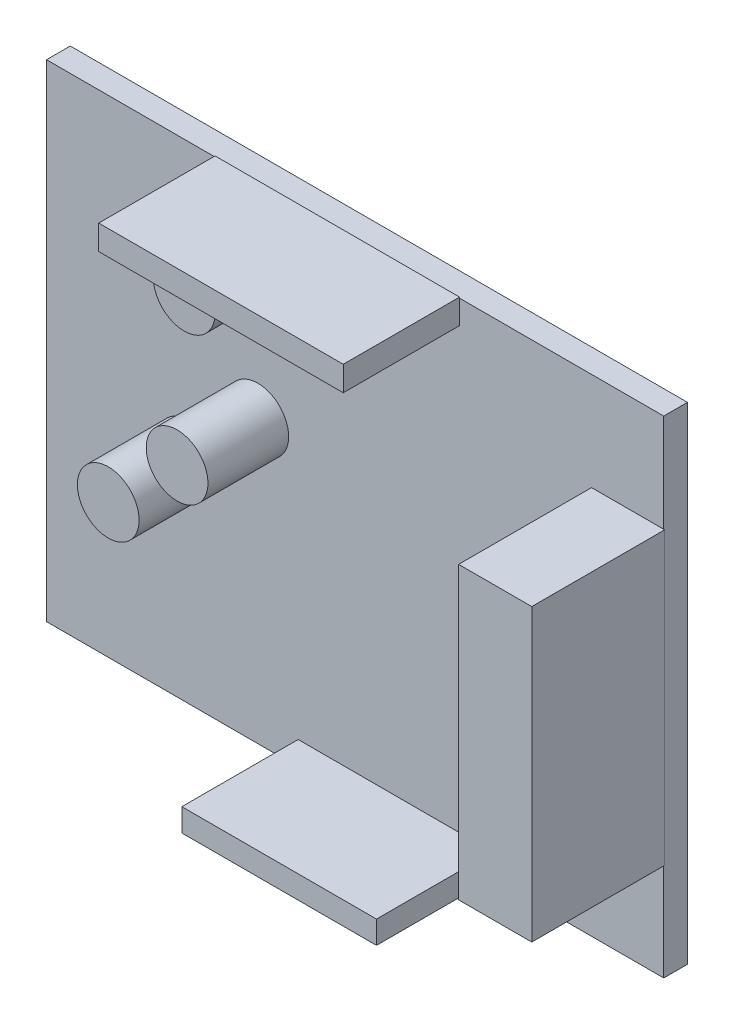
ISO-10303-21;
HEADER;
FILE_DESCRIPTION(('STEP AP214'),'2;1');
FILE_NAME('part.step','',(''),(''),'','','');
FILE_SCHEMA(('AUTOMOTIVE_DESIGN { 1 0 10303 214 1 1 1 1 }'));
ENDSEC;
DATA;
#1=APPLICATION_CONTEXT('core data for automotive mechanical design processes');
#2=APPLICATION_PROTOCOL_DEFINITION('international standard','automotive_design',2000,#1);
#3=PRODUCT_CONTEXT('',#1,'mechanical');
#4=PRODUCT('Part','Part','',(#3));
#5=PRODUCT_RELATED_PRODUCT_CATEGORY('part','',(#4));
#6=PRODUCT_DEFINITION_FORMATION('','',#4);
#7=PRODUCT_DEFINITION_CONTEXT('part definition',#1,'design');
#8=PRODUCT_DEFINITION('design','',#6,#7);
#9=PRODUCT_DEFINITION_SHAPE('','',#8);
#10=(LENGTH_UNIT() NAMED_UNIT(*) SI_UNIT(.MILLI.,.METRE.));
#11=(NAMED_UNIT(*) PLANE_ANGLE_UNIT() SI_UNIT($,.RADIAN.));
#12=(NAMED_UNIT(*) SI_UNIT($,.STERADIAN.) SOLID_ANGLE_UNIT());
#13=UNCERTAINTY_MEASURE_WITH_UNIT(LENGTH_MEASURE(1.E-05),#10,'distance_accuracy_value','');
#14=(GEOMETRIC_REPRESENTATION_CONTEXT(3) GLOBAL_UNCERTAINTY_ASSIGNED_CONTEXT((#13)) GLOBAL_UNIT_ASSIGNED_CONTEXT((#10,
#11,#12)) REPRESENTATION_CONTEXT('',''));
#15=CARTESIAN_POINT('',(0.,0.,0.));
#16=DIRECTION('',(0.,0.,1.));
#17=DIRECTION('',(1.,0.,0.));
#18=AXIS2_PLACEMENT_3D('',#15,#16,#17);
#19=CARTESIAN_POINT('',(-6.,-23.125,12.25));
#20=DIRECTION('',(1.,0.,0.));
#21=DIRECTION('',(0.,0.,-1.));
#22=AXIS2_PLACEMENT_3D('',#19,#20,#21);
#23=PLANE('',#22);
#24=DIRECTION('',(0.,0.,-1.));
#25=VECTOR('',#24,1.);
#26=CARTESIAN_POINT('',(-6.,-25.525,12.25));
#27=LINE('',#26,#25);
#28=CARTESIAN_POINT('',(-6.,-25.525,12.25));
#29=VERTEX_POINT('',#28);
#30=CARTESIAN_POINT('',(-6.,-25.525,0.));
#31=VERTEX_POINT('',#30);
#32=EDGE_CURVE('E216',#29,#31,#27,.T.);
#33=ORIENTED_EDGE('',*,*,#32,.F.);
#34=DIRECTION('',(0.,-1.,0.));
#35=VECTOR('',#34,1.);
#36=CARTESIAN_POINT('',(-6.,-23.125,12.25));
#37=LINE('',#36,#35);
#38=CARTESIAN_POINT('',(-6.,-23.125,12.25));
#39=VERTEX_POINT('',#38);
#40=EDGE_CURVE('E225',#39,#29,#37,.T.);
#41=ORIENTED_EDGE('',*,*,#40,.F.);
#42=DIRECTION('',(0.,0.,-1.));
#43=VECTOR('',#42,1.);
#44=CARTESIAN_POINT('',(-6.,-23.125,12.25));
#45=LINE('',#44,#43);
#46=CARTESIAN_POINT('',(-6.,-23.125,0.));
#47=VERTEX_POINT('',#46);
#48=EDGE_CURVE('E233',#39,#47,#45,.T.);
#49=ORIENTED_EDGE('',*,*,#48,.T.);
#50=DIRECTION('',(0.,-1.,0.));
#51=VECTOR('',#50,1.);
#52=CARTESIAN_POINT('',(-6.,-23.125,0.));
#53=LINE('',#52,#51);
#54=EDGE_CURVE('E224',#47,#31,#53,.T.);
#55=ORIENTED_EDGE('',*,*,#54,.T.);
#56=EDGE_LOOP('',(#33,#41,#49,#55));
#57=FACE_BOUND('',#56,.T.);
#58=ADVANCED_FACE('F33',(#57),#23,.F.);
#59=CARTESIAN_POINT('',(14.5,-23.125,12.25));
#60=DIRECTION('',(-1.,0.,0.));
#61=DIRECTION('',(0.,-1.,0.));
#62=AXIS2_PLACEMENT_3D('',#59,#60,#61);
#63=PLANE('',#62);
#64=DIRECTION('',(0.,0.,1.));
#65=VECTOR('',#64,1.);
#66=CARTESIAN_POINT('',(14.5,-25.525,12.25));
#67=LINE('',#66,#65);
#68=CARTESIAN_POINT('',(14.5,-25.525,0.));
#69=VERTEX_POINT('',#68);
#70=CARTESIAN_POINT('',(14.5,-25.525,12.25));
#71=VERTEX_POINT('',#70);
#72=EDGE_CURVE('E48',#69,#71,#67,.T.);
#73=ORIENTED_EDGE('',*,*,#72,.F.);
#74=DIRECTION('',(0.,1.,0.));
#75=VECTOR('',#74,1.);
#76=CARTESIAN_POINT('',(14.5,-23.125,0.));
#77=LINE('',#76,#75);
#78=CARTESIAN_POINT('',(14.5,-23.125,0.));
#79=VERTEX_POINT('',#78);
#80=EDGE_CURVE('E55',#69,#79,#77,.T.);
#81=ORIENTED_EDGE('',*,*,#80,.T.);
#82=DIRECTION('',(0.,0.,-1.));
#83=VECTOR('',#82,1.);
#84=CARTESIAN_POINT('',(14.5,-23.125,12.25));
#85=LINE('',#84,#83);
#86=CARTESIAN_POINT('',(14.5,-23.125,12.25));
#87=VERTEX_POINT('',#86);
#88=EDGE_CURVE('E241',#87,#79,#85,.T.);
#89=ORIENTED_EDGE('',*,*,#88,.F.);
#90=DIRECTION('',(0.,1.,0.));
#91=VECTOR('',#90,1.);
#92=CARTESIAN_POINT('',(14.5,-23.125,12.25));
#93=LINE('',#92,#91);
#94=EDGE_CURVE('E228',#71,#87,#93,.T.);
#95=ORIENTED_EDGE('',*,*,#94,.F.);
#96=EDGE_LOOP('',(#73,#81,#89,#95));
#97=FACE_BOUND('',#96,.T.);
#98=ADVANCED_FACE('F347',(#97),#63,.F.);
#99=CARTESIAN_POINT('',(0.,0.,12.25));
#100=DIRECTION('',(0.,0.,1.));
#101=DIRECTION('',(1.,0.,0.));
#102=AXIS2_PLACEMENT_3D('',#99,#100,#101);
#103=PLANE('',#102);
#104=ORIENTED_EDGE('',*,*,#40,.T.);
#105=DIRECTION('',(-1.,0.,0.));
#106=VECTOR('',#105,1.);
#107=CARTESIAN_POINT('',(-6.,-25.525,12.25));
#108=LINE('',#107,#106);
#109=EDGE_CURVE('E222',#71,#29,#108,.T.);
#110=ORIENTED_EDGE('',*,*,#109,.F.);
#111=ORIENTED_EDGE('',*,*,#94,.T.);
#112=DIRECTION('',(-1.,0.,0.));
#113=VECTOR('',#112,1.);
#114=CARTESIAN_POINT('',(-6.,-23.125,12.25));
#115=LINE('',#114,#113);
#116=EDGE_CURVE('E231',#87,#39,#115,.T.);
#117=ORIENTED_EDGE('',*,*,#116,.T.);
#118=EDGE_LOOP('',(#104,#110,#111,#117));
#119=FACE_BOUND('',#118,.T.);
#120=ADVANCED_FACE('F335',(#119),#103,.T.);
#121=CARTESIAN_POINT('',(0.,0.,0.));
#122=DIRECTION('',(0.,0.,1.));
#123=DIRECTION('',(1.,0.,0.));
#124=AXIS2_PLACEMENT_3D('',#121,#122,#123);
#125=PLANE('',#124);
#126=DIRECTION('',(1.,0.,0.));
#127=VECTOR('',#126,1.);
#128=CARTESIAN_POINT('',(32.5,-25.625,0.));
#129=LINE('',#128,#127);
#130=CARTESIAN_POINT('',(-32.5,-25.625,0.));
#131=VERTEX_POINT('',#130);
#132=CARTESIAN_POINT('',(32.5,-25.625,0.));
#133=VERTEX_POINT('',#132);
#134=EDGE_CURVE('E310',#131,#133,#129,.T.);
#135=ORIENTED_EDGE('',*,*,#134,.T.);
#136=DIRECTION('',(0.,1.,0.));
#137=VECTOR('',#136,1.);
#138=CARTESIAN_POINT('',(32.5,-25.625,0.));
#139=LINE('',#138,#137);
#140=CARTESIAN_POINT('',(32.5,-15.3,0.));
#141=VERTEX_POINT('',#140);
#142=EDGE_CURVE('E313',#133,#141,#139,.T.);
#143=ORIENTED_EDGE('',*,*,#142,.T.);
#144=DIRECTION('',(1.,0.,0.));
#145=VECTOR('',#144,1.);
#146=CARTESIAN_POINT('',(32.5,-15.3,0.));
#147=LINE('',#146,#145);
#148=CARTESIAN_POINT('',(24.9,-15.3,0.));
#149=VERTEX_POINT('',#148);
#150=EDGE_CURVE('E285',#149,#141,#147,.T.);
#151=ORIENTED_EDGE('',*,*,#150,.F.);
#152=DIRECTION('',(0.,-1.,0.));
#153=VECTOR('',#152,1.);
#154=CARTESIAN_POINT('',(24.9,-15.3,0.));
#155=LINE('',#154,#153);
#156=CARTESIAN_POINT('',(24.9,15.3,0.));
#157=VERTEX_POINT('',#156);
#158=EDGE_CURVE('E276',#157,#149,#155,.T.);
#159=ORIENTED_EDGE('',*,*,#158,.F.);
#160=DIRECTION('',(-1.,0.,0.));
#161=VECTOR('',#160,1.);
#162=CARTESIAN_POINT('',(32.5,15.3,0.));
#163=LINE('',#162,#161);
#164=CARTESIAN_POINT('',(32.5,15.3,0.));
#165=VERTEX_POINT('',#164);
#166=EDGE_CURVE('E279',#165,#157,#163,.T.);
#167=ORIENTED_EDGE('',*,*,#166,.F.);
#168=CARTESIAN_POINT('',(32.5,25.625,0.));
#169=VERTEX_POINT('',#168);
#170=EDGE_CURVE('E312',#165,#169,#139,.T.);
#171=ORIENTED_EDGE('',*,*,#170,.T.);
#172=DIRECTION('',(-1.,0.,0.));
#173=VECTOR('',#172,1.);
#174=CARTESIAN_POINT('',(32.5,25.625,0.));
#175=LINE('',#174,#173);
#176=CARTESIAN_POINT('',(11.,25.625,0.));
#177=VERTEX_POINT('',#176);
#178=EDGE_CURVE('E298',#169,#177,#175,.T.);
#179=ORIENTED_EDGE('',*,*,#178,.T.);
#180=DIRECTION('',(0.,1.,0.));
#181=VECTOR('',#180,1.);
#182=CARTESIAN_POINT('',(11.,25.625,0.));
#183=LINE('',#182,#181);
#184=CARTESIAN_POINT('',(11.,23.125,0.));
#185=VERTEX_POINT('',#184);
#186=EDGE_CURVE('E255',#185,#177,#183,.T.);
#187=ORIENTED_EDGE('',*,*,#186,.F.);
#188=DIRECTION('',(1.,0.,0.));
#189=VECTOR('',#188,1.);
#190=CARTESIAN_POINT('',(-14.75,23.125,0.));
#191=LINE('',#190,#189);
#192=CARTESIAN_POINT('',(-14.75,23.125,0.));
#193=VERTEX_POINT('',#192);
#194=EDGE_CURVE('E262',#193,#185,#191,.T.);
#195=ORIENTED_EDGE('',*,*,#194,.F.);
#196=DIRECTION('',(0.,-1.,0.));
#197=VECTOR('',#196,1.);
#198=CARTESIAN_POINT('',(-14.75,25.625,0.));
#199=LINE('',#198,#197);
#200=CARTESIAN_POINT('',(-14.75,25.625,0.));
#201=VERTEX_POINT('',#200);
#202=EDGE_CURVE('E248',#201,#193,#199,.T.);
#203=ORIENTED_EDGE('',*,*,#202,.F.);
#204=CARTESIAN_POINT('',(-32.5,25.625,0.));
#205=VERTEX_POINT('',#204);
#206=EDGE_CURVE('E316',#201,#205,#175,.T.);
#207=ORIENTED_EDGE('',*,*,#206,.T.);
#208=DIRECTION('',(0.,-1.,0.));
#209=VECTOR('',#208,1.);
#210=CARTESIAN_POINT('',(-32.5,-25.625,0.));
#211=LINE('',#210,#209);
#212=EDGE_CURVE('E293',#205,#131,#211,.T.);
#213=ORIENTED_EDGE('',*,*,#212,.T.);
#214=EDGE_LOOP('',(#135,#143,#151,#159,#167,#171,#179,#187,#195,#203,#207,#213));
#215=FACE_BOUND('',#214,.T.);
#216=CARTESIAN_POINT('',(-9.5,19.87,0.));
#217=DIRECTION('',(0.,0.,1.));
#218=DIRECTION('',(1.,0.,0.));
#219=AXIS2_PLACEMENT_3D('',#216,#217,#218);
#220=CIRCLE('',#219,3.25);
#221=CARTESIAN_POINT('',(-6.25,19.87,0.));
#222=VERTEX_POINT('',#221);
#223=EDGE_CURVE('E244',#222,#222,#220,.T.);
#224=ORIENTED_EDGE('',*,*,#223,.F.);
#225=EDGE_LOOP('',(#224));
#226=FACE_BOUND('',#225,.T.);
#227=CARTESIAN_POINT('',(-10.25,4.,0.));
#228=DIRECTION('',(0.,0.,1.));
#229=DIRECTION('',(1.,0.,0.));
#230=AXIS2_PLACEMENT_3D('',#227,#228,#229);
#231=CIRCLE('',#230,3.25);
#232=CARTESIAN_POINT('',(-7.,4.,0.));
#233=VERTEX_POINT('',#232);
#234=EDGE_CURVE('E272',#233,#233,#231,.T.);
#235=ORIENTED_EDGE('',*,*,#234,.F.);
#236=EDGE_LOOP('',(#235));
#237=FACE_BOUND('',#236,.T.);
#238=CARTESIAN_POINT('',(-17.5,-3.,0.));
#239=DIRECTION('',(0.,0.,1.));
#240=DIRECTION('',(1.,0.,0.));
#241=AXIS2_PLACEMENT_3D('',#238,#239,#240);
#242=CIRCLE('',#241,3.25);
#243=CARTESIAN_POINT('',(-14.25,-3.,0.));
#244=VERTEX_POINT('',#243);
#245=EDGE_CURVE('E41',#244,#244,#242,.T.);
#246=ORIENTED_EDGE('',*,*,#245,.F.);
#247=EDGE_LOOP('',(#246));
#248=FACE_BOUND('',#247,.T.);
#249=DIRECTION('',(1.,0.,0.));
#250=VECTOR('',#249,1.);
#251=CARTESIAN_POINT('',(-6.,-25.525,0.));
#252=LINE('',#251,#250);
#253=EDGE_CURVE('E219',#31,#69,#252,.T.);
#254=ORIENTED_EDGE('',*,*,#253,.F.);
#255=ORIENTED_EDGE('',*,*,#54,.F.);
#256=DIRECTION('',(-1.,0.,0.));
#257=VECTOR('',#256,1.);
#258=CARTESIAN_POINT('',(-6.,-23.125,0.));
#259=LINE('',#258,#257);
#260=EDGE_CURVE('E229',#79,#47,#259,.T.);
#261=ORIENTED_EDGE('',*,*,#260,.F.);
#262=ORIENTED_EDGE('',*,*,#80,.F.);
#263=EDGE_LOOP('',(#254,#255,#261,#262));
#264=FACE_BOUND('',#263,.T.);
#265=ADVANCED_FACE('F332',(#215,#226,#237,#248,#264),#125,.T.);
#266=CARTESIAN_POINT('',(-17.5,-3.,8.5));
#267=DIRECTION('',(0.,0.,-1.));
#268=DIRECTION('',(-1.,0.,0.));
#269=AXIS2_PLACEMENT_3D('',#266,#267,#268);
#270=CYLINDRICAL_SURFACE('',#269,3.25);
#271=CARTESIAN_POINT('',(-17.5,-3.,8.5));
#272=DIRECTION('',(0.,0.,1.));
#273=DIRECTION('',(1.,0.,0.));
#274=AXIS2_PLACEMENT_3D('',#271,#272,#273);
#275=CIRCLE('',#274,3.25);
#276=CARTESIAN_POINT('',(-14.25,-3.,8.5));
#277=VERTEX_POINT('',#276);
#278=EDGE_CURVE('E11',#277,#277,#275,.T.);
#279=ORIENTED_EDGE('',*,*,#278,.F.);
#280=EDGE_LOOP('',(#279));
#281=FACE_BOUND('',#280,.T.);
#282=ORIENTED_EDGE('',*,*,#245,.T.);
#283=EDGE_LOOP('',(#282));
#284=FACE_BOUND('',#283,.T.);
#285=ADVANCED_FACE('F35',(#281,#284),#270,.T.);
#286=CARTESIAN_POINT('',(-17.5,-3.,8.5));
#287=DIRECTION('',(0.,0.,1.));
#288=DIRECTION('',(1.,0.,0.));
#289=AXIS2_PLACEMENT_3D('',#286,#287,#288);
#290=PLANE('',#289);
#291=ORIENTED_EDGE('',*,*,#278,.T.);
#292=EDGE_LOOP('',(#291));
#293=FACE_BOUND('',#292,.T.);
#294=ADVANCED_FACE('F425',(#293),#290,.T.);
#295=CARTESIAN_POINT('',(-32.5,-25.625,-2.5));
#296=DIRECTION('',(-1.,0.,0.));
#297=DIRECTION('',(0.,0.,1.));
#298=AXIS2_PLACEMENT_3D('',#295,#296,#297);
#299=PLANE('',#298);
#300=ORIENTED_EDGE('',*,*,#212,.F.);
#301=DIRECTION('',(0.,0.,1.));
#302=VECTOR('',#301,1.);
#303=CARTESIAN_POINT('',(-32.5,25.625,-2.5));
#304=LINE('',#303,#302);
#305=CARTESIAN_POINT('',(-32.5,25.625,-2.5));
#306=VERTEX_POINT('',#305);
#307=EDGE_CURVE('E319',#306,#205,#304,.T.);
#308=ORIENTED_EDGE('',*,*,#307,.F.);
#309=DIRECTION('',(0.,-1.,0.));
#310=VECTOR('',#309,1.);
#311=CARTESIAN_POINT('',(-32.5,-25.625,-2.5));
#312=LINE('',#311,#310);
#313=CARTESIAN_POINT('',(-32.5,-25.625,-2.5));
#314=VERTEX_POINT('',#313);
#315=EDGE_CURVE('E294',#306,#314,#312,.T.);
#316=ORIENTED_EDGE('',*,*,#315,.T.);
#317=DIRECTION('',(0.,0.,1.));
#318=VECTOR('',#317,1.);
#319=CARTESIAN_POINT('',(-32.5,-25.625,-2.5));
#320=LINE('',#319,#318);
#321=EDGE_CURVE('E307',#314,#131,#320,.T.);
#322=ORIENTED_EDGE('',*,*,#321,.T.);
#323=EDGE_LOOP('',(#300,#308,#316,#322));
#324=FACE_BOUND('',#323,.T.);
#325=ADVANCED_FACE('F417',(#324),#299,.T.);
#326=CARTESIAN_POINT('',(32.5,25.625,-2.5));
#327=DIRECTION('',(0.,1.,0.));
#328=DIRECTION('',(0.,0.,1.));
#329=AXIS2_PLACEMENT_3D('',#326,#327,#328);
#330=PLANE('',#329);
#331=DIRECTION('',(-1.,0.,0.));
#332=VECTOR('',#331,1.);
#333=CARTESIAN_POINT('',(11.,25.625,0.));
#334=LINE('',#333,#332);
#335=EDGE_CURVE('E196',#177,#201,#334,.T.);
#336=ORIENTED_EDGE('',*,*,#335,.F.);
#337=ORIENTED_EDGE('',*,*,#178,.F.);
#338=DIRECTION('',(0.,0.,1.));
#339=VECTOR('',#338,1.);
#340=CARTESIAN_POINT('',(32.5,25.625,-2.5));
#341=LINE('',#340,#339);
#342=CARTESIAN_POINT('',(32.5,25.625,-2.5));
#343=VERTEX_POINT('',#342);
#344=EDGE_CURVE('E322',#343,#169,#341,.T.);
#345=ORIENTED_EDGE('',*,*,#344,.F.);
#346=DIRECTION('',(-1.,0.,0.));
#347=VECTOR('',#346,1.);
#348=CARTESIAN_POINT('',(32.5,25.625,-2.5));
#349=LINE('',#348,#347);
#350=EDGE_CURVE('E304',#343,#306,#349,.T.);
#351=ORIENTED_EDGE('',*,*,#350,.T.);
#352=ORIENTED_EDGE('',*,*,#307,.T.);
#353=ORIENTED_EDGE('',*,*,#206,.F.);
#354=EDGE_LOOP('',(#336,#337,#345,#351,#352,#353));
#355=FACE_BOUND('',#354,.T.);
#356=ADVANCED_FACE('F413',(#355),#330,.T.);
#357=CARTESIAN_POINT('',(32.5,-25.625,-2.5));
#358=DIRECTION('',(1.,0.,0.));
#359=DIRECTION('',(0.,0.,-1.));
#360=AXIS2_PLACEMENT_3D('',#357,#358,#359);
#361=PLANE('',#360);
#362=DIRECTION('',(0.,1.,0.));
#363=VECTOR('',#362,1.);
#364=CARTESIAN_POINT('',(32.5,15.3,0.));
#365=LINE('',#364,#363);
#366=EDGE_CURVE('E185',#141,#165,#365,.T.);
#367=ORIENTED_EDGE('',*,*,#366,.F.);
#368=ORIENTED_EDGE('',*,*,#142,.F.);
#369=DIRECTION('',(0.,0.,1.));
#370=VECTOR('',#369,1.);
#371=CARTESIAN_POINT('',(32.5,-25.625,-2.5));
#372=LINE('',#371,#370);
#373=CARTESIAN_POINT('',(32.5,-25.625,-2.5));
#374=VERTEX_POINT('',#373);
#375=EDGE_CURVE('E325',#374,#133,#372,.T.);
#376=ORIENTED_EDGE('',*,*,#375,.F.);
#377=DIRECTION('',(0.,1.,0.));
#378=VECTOR('',#377,1.);
#379=CARTESIAN_POINT('',(32.5,-25.625,-2.5));
#380=LINE('',#379,#378);
#381=EDGE_CURVE('E301',#374,#343,#380,.T.);
#382=ORIENTED_EDGE('',*,*,#381,.T.);
#383=ORIENTED_EDGE('',*,*,#344,.T.);
#384=ORIENTED_EDGE('',*,*,#170,.F.);
#385=EDGE_LOOP('',(#367,#368,#376,#382,#383,#384));
#386=FACE_BOUND('',#385,.T.);
#387=ADVANCED_FACE('F416',(#386),#361,.T.);
#388=CARTESIAN_POINT('',(32.5,-25.625,-2.5));
#389=DIRECTION('',(0.,-1.,0.));
#390=DIRECTION('',(0.,0.,-1.));
#391=AXIS2_PLACEMENT_3D('',#388,#389,#390);
#392=PLANE('',#391);
#393=ORIENTED_EDGE('',*,*,#375,.T.);
#394=ORIENTED_EDGE('',*,*,#134,.F.);
#395=ORIENTED_EDGE('',*,*,#321,.F.);
#396=DIRECTION('',(1.,0.,0.));
#397=VECTOR('',#396,1.);
#398=CARTESIAN_POINT('',(32.5,-25.625,-2.5));
#399=LINE('',#398,#397);
#400=EDGE_CURVE('E297',#314,#374,#399,.T.);
#401=ORIENTED_EDGE('',*,*,#400,.T.);
#402=EDGE_LOOP('',(#393,#394,#395,#401));
#403=FACE_BOUND('',#402,.T.);
#404=ADVANCED_FACE('F410',(#403),#392,.T.);
#405=CARTESIAN_POINT('',(0.,0.,-2.5));
#406=DIRECTION('',(0.,0.,1.));
#407=DIRECTION('',(1.,0.,0.));
#408=AXIS2_PLACEMENT_3D('',#405,#406,#407);
#409=PLANE('',#408);
#410=ORIENTED_EDGE('',*,*,#315,.F.);
#411=ORIENTED_EDGE('',*,*,#350,.F.);
#412=ORIENTED_EDGE('',*,*,#381,.F.);
#413=ORIENTED_EDGE('',*,*,#400,.F.);
#414=EDGE_LOOP('',(#410,#411,#412,#413));
#415=FACE_BOUND('',#414,.T.);
#416=ADVANCED_FACE('F407',(#415),#409,.F.);
#417=CARTESIAN_POINT('',(24.9,-15.3,14.));
#418=DIRECTION('',(1.,0.,0.));
#419=DIRECTION('',(0.,0.,-1.));
#420=AXIS2_PLACEMENT_3D('',#417,#418,#419);
#421=PLANE('',#420);
#422=ORIENTED_EDGE('',*,*,#158,.T.);
#423=DIRECTION('',(0.,0.,-1.));
#424=VECTOR('',#423,1.);
#425=CARTESIAN_POINT('',(24.9,-15.3,14.));
#426=LINE('',#425,#424);
#427=CARTESIAN_POINT('',(24.9,-15.3,14.));
#428=VERTEX_POINT('',#427);
#429=EDGE_CURVE('E291',#428,#149,#426,.T.);
#430=ORIENTED_EDGE('',*,*,#429,.F.);
#431=DIRECTION('',(0.,-1.,0.));
#432=VECTOR('',#431,1.);
#433=CARTESIAN_POINT('',(24.9,-15.3,14.));
#434=LINE('',#433,#432);
#435=CARTESIAN_POINT('',(24.9,15.3,14.));
#436=VERTEX_POINT('',#435);
#437=EDGE_CURVE('E165',#436,#428,#434,.T.);
#438=ORIENTED_EDGE('',*,*,#437,.F.);
#439=DIRECTION('',(0.,0.,-1.));
#440=VECTOR('',#439,1.);
#441=CARTESIAN_POINT('',(24.9,15.3,14.));
#442=LINE('',#441,#440);
#443=EDGE_CURVE('E282',#436,#157,#442,.T.);
#444=ORIENTED_EDGE('',*,*,#443,.T.);
#445=EDGE_LOOP('',(#422,#430,#438,#444));
#446=FACE_BOUND('',#445,.T.);
#447=ADVANCED_FACE('F404',(#446),#421,.F.);
#448=CARTESIAN_POINT('',(32.5,-15.3,14.));
#449=DIRECTION('',(0.,1.,0.));
#450=DIRECTION('',(-1.,0.,0.));
#451=AXIS2_PLACEMENT_3D('',#448,#449,#450);
#452=PLANE('',#451);
#453=ORIENTED_EDGE('',*,*,#150,.T.);
#454=DIRECTION('',(-1.,0.,0.));
#455=VECTOR('',#454,1.);
#456=CARTESIAN_POINT('',(32.6,-15.3,0.));
#457=LINE('',#456,#455);
#458=CARTESIAN_POINT('',(32.6,-15.3,0.));
#459=VERTEX_POINT('',#458);
#460=EDGE_CURVE('E176',#459,#141,#457,.T.);
#461=ORIENTED_EDGE('',*,*,#460,.F.);
#462=DIRECTION('',(0.,0.,-1.));
#463=VECTOR('',#462,1.);
#464=CARTESIAN_POINT('',(32.6,-15.3,14.));
#465=LINE('',#464,#463);
#466=CARTESIAN_POINT('',(32.6,-15.3,14.));
#467=VERTEX_POINT('',#466);
#468=EDGE_CURVE('E172',#467,#459,#465,.T.);
#469=ORIENTED_EDGE('',*,*,#468,.F.);
#470=DIRECTION('',(1.,0.,0.));
#471=VECTOR('',#470,1.);
#472=CARTESIAN_POINT('',(32.5,-15.3,14.));
#473=LINE('',#472,#471);
#474=EDGE_CURVE('E159',#428,#467,#473,.T.);
#475=ORIENTED_EDGE('',*,*,#474,.F.);
#476=ORIENTED_EDGE('',*,*,#429,.T.);
#477=EDGE_LOOP('',(#453,#461,#469,#475,#476));
#478=FACE_BOUND('',#477,.T.);
#479=ADVANCED_FACE('F174',(#478),#452,.F.);
#480=CARTESIAN_POINT('',(32.5,15.3,14.));
#481=DIRECTION('',(0.,-1.,0.));
#482=DIRECTION('',(1.,0.,0.));
#483=AXIS2_PLACEMENT_3D('',#480,#481,#482);
#484=PLANE('',#483);
#485=ORIENTED_EDGE('',*,*,#166,.T.);
#486=ORIENTED_EDGE('',*,*,#443,.F.);
#487=DIRECTION('',(-1.,0.,0.));
#488=VECTOR('',#487,1.);
#489=CARTESIAN_POINT('',(32.5,15.3,14.));
#490=LINE('',#489,#488);
#491=CARTESIAN_POINT('',(32.6,15.3,14.));
#492=VERTEX_POINT('',#491);
#493=EDGE_CURVE('E169',#492,#436,#490,.T.);
#494=ORIENTED_EDGE('',*,*,#493,.F.);
#495=DIRECTION('',(0.,0.,1.));
#496=VECTOR('',#495,1.);
#497=CARTESIAN_POINT('',(32.6,15.3,14.));
#498=LINE('',#497,#496);
#499=CARTESIAN_POINT('',(32.6,15.3,0.));
#500=VERTEX_POINT('',#499);
#501=EDGE_CURVE('E184',#500,#492,#498,.T.);
#502=ORIENTED_EDGE('',*,*,#501,.F.);
#503=DIRECTION('',(-1.,0.,0.));
#504=VECTOR('',#503,1.);
#505=CARTESIAN_POINT('',(32.6,15.3,0.));
#506=LINE('',#505,#504);
#507=EDGE_CURVE('E191',#500,#165,#506,.T.);
#508=ORIENTED_EDGE('',*,*,#507,.T.);
#509=EDGE_LOOP('',(#485,#486,#494,#502,#508));
#510=FACE_BOUND('',#509,.T.);
#511=ADVANCED_FACE('F398',(#510),#484,.F.);
#512=CARTESIAN_POINT('',(0.,0.,14.));
#513=DIRECTION('',(0.,0.,1.));
#514=DIRECTION('',(1.,0.,0.));
#515=AXIS2_PLACEMENT_3D('',#512,#513,#514);
#516=PLANE('',#515);
#517=ORIENTED_EDGE('',*,*,#437,.T.);
#518=ORIENTED_EDGE('',*,*,#474,.T.);
#519=DIRECTION('',(0.,-1.,0.));
#520=VECTOR('',#519,1.);
#521=CARTESIAN_POINT('',(32.6,15.3,14.));
#522=LINE('',#521,#520);
#523=EDGE_CURVE('E163',#492,#467,#522,.T.);
#524=ORIENTED_EDGE('',*,*,#523,.F.);
#525=ORIENTED_EDGE('',*,*,#493,.T.);
#526=EDGE_LOOP('',(#517,#518,#524,#525));
#527=FACE_BOUND('',#526,.T.);
#528=ADVANCED_FACE('F161',(#527),#516,.T.);
#529=CARTESIAN_POINT('',(-10.25,4.,8.5));
#530=DIRECTION('',(0.,0.,-1.));
#531=DIRECTION('',(-1.,0.,0.));
#532=AXIS2_PLACEMENT_3D('',#529,#530,#531);
#533=CYLINDRICAL_SURFACE('',#532,3.25);
#534=CARTESIAN_POINT('',(-10.25,4.,8.5));
#535=DIRECTION('',(0.,0.,1.));
#536=DIRECTION('',(1.,0.,0.));
#537=AXIS2_PLACEMENT_3D('',#534,#535,#536);
#538=CIRCLE('',#537,3.25);
#539=CARTESIAN_POINT('',(-7.,4.,8.5));
#540=VERTEX_POINT('',#539);
#541=EDGE_CURVE('E273',#540,#540,#538,.T.);
#542=ORIENTED_EDGE('',*,*,#541,.F.);
#543=EDGE_LOOP('',(#542));
#544=FACE_BOUND('',#543,.T.);
#545=ORIENTED_EDGE('',*,*,#234,.T.);
#546=EDGE_LOOP('',(#545));
#547=FACE_BOUND('',#546,.T.);
#548=ADVANCED_FACE('F391',(#544,#547),#533,.T.);
#549=CARTESIAN_POINT('',(-10.25,4.,8.5));
#550=DIRECTION('',(0.,0.,1.));
#551=DIRECTION('',(1.,0.,0.));
#552=AXIS2_PLACEMENT_3D('',#549,#550,#551);
#553=PLANE('',#552);
#554=ORIENTED_EDGE('',*,*,#541,.T.);
#555=EDGE_LOOP('',(#554));
#556=FACE_BOUND('',#555,.T.);
#557=ADVANCED_FACE('F387',(#556),#553,.T.);
#558=CARTESIAN_POINT('',(-14.75,25.625,12.25));
#559=DIRECTION('',(1.,0.,0.));
#560=DIRECTION('',(0.,0.,-1.));
#561=AXIS2_PLACEMENT_3D('',#558,#559,#560);
#562=PLANE('',#561);
#563=ORIENTED_EDGE('',*,*,#202,.T.);
#564=DIRECTION('',(0.,0.,-1.));
#565=VECTOR('',#564,1.);
#566=CARTESIAN_POINT('',(-14.75,23.125,12.25));
#567=LINE('',#566,#565);
#568=CARTESIAN_POINT('',(-14.75,23.125,12.25));
#569=VERTEX_POINT('',#568);
#570=EDGE_CURVE('E269',#569,#193,#567,.T.);
#571=ORIENTED_EDGE('',*,*,#570,.F.);
#572=DIRECTION('',(0.,-1.,0.));
#573=VECTOR('',#572,1.);
#574=CARTESIAN_POINT('',(-14.75,25.625,12.25));
#575=LINE('',#574,#573);
#576=CARTESIAN_POINT('',(-14.75,25.725,12.25));
#577=VERTEX_POINT('',#576);
#578=EDGE_CURVE('E251',#577,#569,#575,.T.);
#579=ORIENTED_EDGE('',*,*,#578,.F.);
#580=DIRECTION('',(0.,0.,1.));
#581=VECTOR('',#580,1.);
#582=CARTESIAN_POINT('',(-14.75,25.725,12.25));
#583=LINE('',#582,#581);
#584=CARTESIAN_POINT('',(-14.75,25.725,0.));
#585=VERTEX_POINT('',#584);
#586=EDGE_CURVE('E202',#585,#577,#583,.T.);
#587=ORIENTED_EDGE('',*,*,#586,.F.);
#588=DIRECTION('',(0.,-1.,0.));
#589=VECTOR('',#588,1.);
#590=CARTESIAN_POINT('',(-14.75,25.725,0.));
#591=LINE('',#590,#589);
#592=EDGE_CURVE('E208',#585,#201,#591,.T.);
#593=ORIENTED_EDGE('',*,*,#592,.T.);
#594=EDGE_LOOP('',(#563,#571,#579,#587,#593));
#595=FACE_BOUND('',#594,.T.);
#596=ADVANCED_FACE('F383',(#595),#562,.F.);
#597=CARTESIAN_POINT('',(-14.75,23.125,12.25));
#598=DIRECTION('',(0.,1.,0.));
#599=DIRECTION('',(0.,0.,1.));
#600=AXIS2_PLACEMENT_3D('',#597,#598,#599);
#601=PLANE('',#600);
#602=ORIENTED_EDGE('',*,*,#194,.T.);
#603=DIRECTION('',(0.,0.,-1.));
#604=VECTOR('',#603,1.);
#605=CARTESIAN_POINT('',(11.,23.125,12.25));
#606=LINE('',#605,#604);
#607=CARTESIAN_POINT('',(11.,23.125,12.25));
#608=VERTEX_POINT('',#607);
#609=EDGE_CURVE('E259',#608,#185,#606,.T.);
#610=ORIENTED_EDGE('',*,*,#609,.F.);
#611=DIRECTION('',(1.,0.,0.));
#612=VECTOR('',#611,1.);
#613=CARTESIAN_POINT('',(-14.75,23.125,12.25));
#614=LINE('',#613,#612);
#615=EDGE_CURVE('E254',#569,#608,#614,.T.);
#616=ORIENTED_EDGE('',*,*,#615,.F.);
#617=ORIENTED_EDGE('',*,*,#570,.T.);
#618=EDGE_LOOP('',(#602,#610,#616,#617));
#619=FACE_BOUND('',#618,.T.);
#620=ADVANCED_FACE('F379',(#619),#601,.F.);
#621=CARTESIAN_POINT('',(11.,25.625,12.25));
#622=DIRECTION('',(-1.,0.,0.));
#623=DIRECTION('',(0.,0.,1.));
#624=AXIS2_PLACEMENT_3D('',#621,#622,#623);
#625=PLANE('',#624);
#626=ORIENTED_EDGE('',*,*,#186,.T.);
#627=DIRECTION('',(0.,-1.,0.));
#628=VECTOR('',#627,1.);
#629=CARTESIAN_POINT('',(11.,25.725,0.));
#630=LINE('',#629,#628);
#631=CARTESIAN_POINT('',(11.,25.725,0.));
#632=VERTEX_POINT('',#631);
#633=EDGE_CURVE('E213',#632,#177,#630,.T.);
#634=ORIENTED_EDGE('',*,*,#633,.F.);
#635=DIRECTION('',(0.,0.,-1.));
#636=VECTOR('',#635,1.);
#637=CARTESIAN_POINT('',(11.,25.725,12.25));
#638=LINE('',#637,#636);
#639=CARTESIAN_POINT('',(11.,25.725,12.25));
#640=VERTEX_POINT('',#639);
#641=EDGE_CURVE('E197',#640,#632,#638,.T.);
#642=ORIENTED_EDGE('',*,*,#641,.F.);
#643=DIRECTION('',(0.,1.,0.));
#644=VECTOR('',#643,1.);
#645=CARTESIAN_POINT('',(11.,25.625,12.25));
#646=LINE('',#645,#644);
#647=EDGE_CURVE('E257',#608,#640,#646,.T.);
#648=ORIENTED_EDGE('',*,*,#647,.F.);
#649=ORIENTED_EDGE('',*,*,#609,.T.);
#650=EDGE_LOOP('',(#626,#634,#642,#648,#649));
#651=FACE_BOUND('',#650,.T.);
#652=ADVANCED_FACE('F375',(#651),#625,.F.);
#653=CARTESIAN_POINT('',(0.,0.,12.25));
#654=DIRECTION('',(0.,0.,1.));
#655=DIRECTION('',(1.,0.,0.));
#656=AXIS2_PLACEMENT_3D('',#653,#654,#655);
#657=PLANE('',#656);
#658=ORIENTED_EDGE('',*,*,#578,.T.);
#659=ORIENTED_EDGE('',*,*,#615,.T.);
#660=ORIENTED_EDGE('',*,*,#647,.T.);
#661=DIRECTION('',(1.,0.,0.));
#662=VECTOR('',#661,1.);
#663=CARTESIAN_POINT('',(11.,25.725,12.25));
#664=LINE('',#663,#662);
#665=EDGE_CURVE('E205',#577,#640,#664,.T.);
#666=ORIENTED_EDGE('',*,*,#665,.F.);
#667=EDGE_LOOP('',(#658,#659,#660,#666));
#668=FACE_BOUND('',#667,.T.);
#669=ADVANCED_FACE('F371',(#668),#657,.T.);
#670=CARTESIAN_POINT('',(-9.5,19.87,8.5));
#671=DIRECTION('',(0.,0.,-1.));
#672=DIRECTION('',(-1.,0.,0.));
#673=AXIS2_PLACEMENT_3D('',#670,#671,#672);
#674=CYLINDRICAL_SURFACE('',#673,3.25);
#675=CARTESIAN_POINT('',(-9.5,19.87,8.5));
#676=DIRECTION('',(0.,0.,1.));
#677=DIRECTION('',(1.,0.,0.));
#678=AXIS2_PLACEMENT_3D('',#675,#676,#677);
#679=CIRCLE('',#678,3.25);
#680=CARTESIAN_POINT('',(-6.25,19.87,8.5));
#681=VERTEX_POINT('',#680);
#682=EDGE_CURVE('E245',#681,#681,#679,.T.);
#683=ORIENTED_EDGE('',*,*,#682,.F.);
#684=EDGE_LOOP('',(#683));
#685=FACE_BOUND('',#684,.T.);
#686=ORIENTED_EDGE('',*,*,#223,.T.);
#687=EDGE_LOOP('',(#686));
#688=FACE_BOUND('',#687,.T.);
#689=ADVANCED_FACE('F367',(#685,#688),#674,.T.);
#690=CARTESIAN_POINT('',(-9.5,19.87,8.5));
#691=DIRECTION('',(0.,0.,1.));
#692=DIRECTION('',(1.,0.,0.));
#693=AXIS2_PLACEMENT_3D('',#690,#691,#692);
#694=PLANE('',#693);
#695=ORIENTED_EDGE('',*,*,#682,.T.);
#696=EDGE_LOOP('',(#695));
#697=FACE_BOUND('',#696,.T.);
#698=ADVANCED_FACE('F364',(#697),#694,.T.);
#699=CARTESIAN_POINT('',(-6.,-23.125,12.25));
#700=DIRECTION('',(0.,-1.,0.));
#701=DIRECTION('',(0.,0.,-1.));
#702=AXIS2_PLACEMENT_3D('',#699,#700,#701);
#703=PLANE('',#702);
#704=ORIENTED_EDGE('',*,*,#260,.T.);
#705=ORIENTED_EDGE('',*,*,#48,.F.);
#706=ORIENTED_EDGE('',*,*,#116,.F.);
#707=ORIENTED_EDGE('',*,*,#88,.T.);
#708=EDGE_LOOP('',(#704,#705,#706,#707));
#709=FACE_BOUND('',#708,.T.);
#710=ADVANCED_FACE('F345',(#709),#703,.F.);
#711=CARTESIAN_POINT('',(0.,-25.525,0.));
#712=DIRECTION('',(0.,-1.,0.));
#713=DIRECTION('',(0.,0.,-1.));
#714=AXIS2_PLACEMENT_3D('',#711,#712,#713);
#715=PLANE('',#714);
#716=ORIENTED_EDGE('',*,*,#32,.T.);
#717=ORIENTED_EDGE('',*,*,#253,.T.);
#718=ORIENTED_EDGE('',*,*,#72,.T.);
#719=ORIENTED_EDGE('',*,*,#109,.T.);
#720=EDGE_LOOP('',(#716,#717,#718,#719));
#721=FACE_BOUND('',#720,.T.);
#722=ADVANCED_FACE('F339',(#721),#715,.T.);
#723=CARTESIAN_POINT('',(11.,25.725,0.));
#724=DIRECTION('',(0.,0.,1.));
#725=DIRECTION('',(1.,0.,0.));
#726=AXIS2_PLACEMENT_3D('',#723,#724,#725);
#727=PLANE('',#726);
#728=ORIENTED_EDGE('',*,*,#335,.T.);
#729=ORIENTED_EDGE('',*,*,#592,.F.);
#730=DIRECTION('',(-1.,0.,0.));
#731=VECTOR('',#730,1.);
#732=CARTESIAN_POINT('',(11.,25.725,0.));
#733=LINE('',#732,#731);
#734=EDGE_CURVE('E200',#632,#585,#733,.T.);
#735=ORIENTED_EDGE('',*,*,#734,.F.);
#736=ORIENTED_EDGE('',*,*,#633,.T.);
#737=EDGE_LOOP('',(#728,#729,#735,#736));
#738=FACE_BOUND('',#737,.T.);
#739=ADVANCED_FACE('F559',(#738),#727,.F.);
#740=CARTESIAN_POINT('',(0.,25.725,0.));
#741=DIRECTION('',(0.,1.,0.));
#742=DIRECTION('',(0.,0.,1.));
#743=AXIS2_PLACEMENT_3D('',#740,#741,#742);
#744=PLANE('',#743);
#745=ORIENTED_EDGE('',*,*,#641,.T.);
#746=ORIENTED_EDGE('',*,*,#734,.T.);
#747=ORIENTED_EDGE('',*,*,#586,.T.);
#748=ORIENTED_EDGE('',*,*,#665,.T.);
#749=EDGE_LOOP('',(#745,#746,#747,#748));
#750=FACE_BOUND('',#749,.T.);
#751=ADVANCED_FACE('F564',(#750),#744,.T.);
#752=CARTESIAN_POINT('',(32.6,15.3,0.));
#753=DIRECTION('',(0.,0.,1.));
#754=DIRECTION('',(1.,0.,0.));
#755=AXIS2_PLACEMENT_3D('',#752,#753,#754);
#756=PLANE('',#755);
#757=ORIENTED_EDGE('',*,*,#366,.T.);
#758=ORIENTED_EDGE('',*,*,#507,.F.);
#759=DIRECTION('',(0.,1.,0.));
#760=VECTOR('',#759,1.);
#761=CARTESIAN_POINT('',(32.6,15.3,0.));
#762=LINE('',#761,#760);
#763=EDGE_CURVE('E179',#459,#500,#762,.T.);
#764=ORIENTED_EDGE('',*,*,#763,.F.);
#765=ORIENTED_EDGE('',*,*,#460,.T.);
#766=EDGE_LOOP('',(#757,#758,#764,#765));
#767=FACE_BOUND('',#766,.T.);
#768=ADVANCED_FACE('F571',(#767),#756,.F.);
#769=CARTESIAN_POINT('',(32.6,0.,0.));
#770=DIRECTION('',(1.,0.,0.));
#771=DIRECTION('',(0.,0.,-1.));
#772=AXIS2_PLACEMENT_3D('',#769,#770,#771);
#773=PLANE('',#772);
#774=ORIENTED_EDGE('',*,*,#523,.T.);
#775=ORIENTED_EDGE('',*,*,#468,.T.);
#776=ORIENTED_EDGE('',*,*,#763,.T.);
#777=ORIENTED_EDGE('',*,*,#501,.T.);
#778=EDGE_LOOP('',(#774,#775,#776,#777));
#779=FACE_BOUND('',#778,.T.);
#780=ADVANCED_FACE('F182',(#779),#773,.T.);
#781=CLOSED_SHELL('',(#58,#98,#120,#265,#285,#294,#325,#356,#387,#404,#416,#447,#479,#511,#528,
#548,#557,#596,#620,#652,#669,#689,#698,#710,#722,#739,#751,#768,#780));
#782=MANIFOLD_SOLID_BREP('B2',#781);
#783=ADVANCED_BREP_SHAPE_REPRESENTATION('',(#18,#782),#14);
#784=SHAPE_DEFINITION_REPRESENTATION(#9,#783);
ENDSEC;
END-ISO-10303-21;
